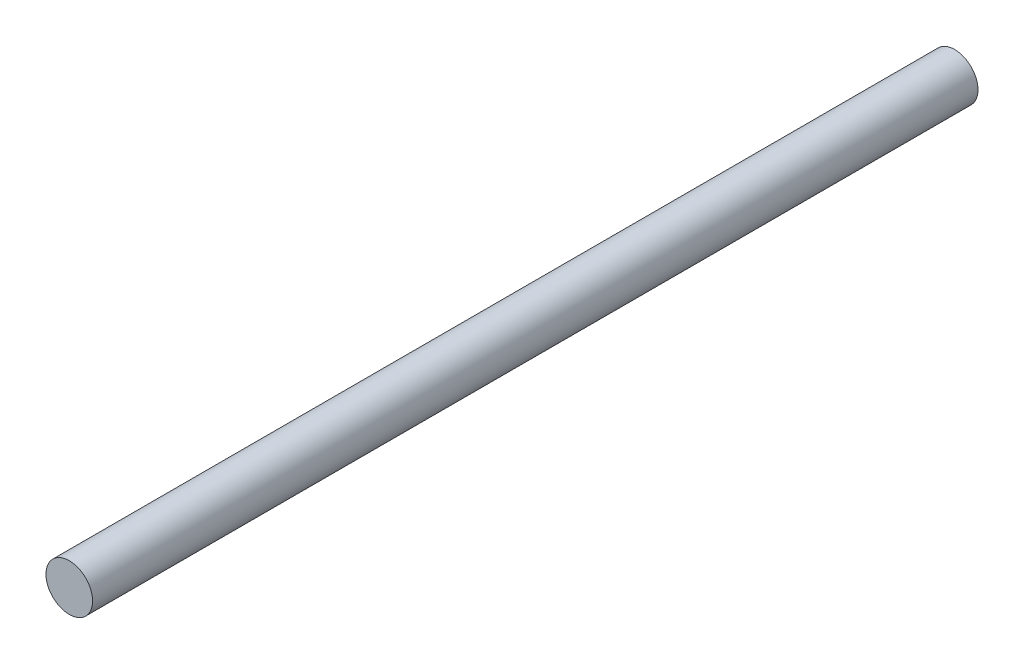
ISO-10303-21;
HEADER;
FILE_DESCRIPTION(('STEP AP214'),'2;1');
FILE_NAME('part.step','',(''),(''),'','','');
FILE_SCHEMA(('AUTOMOTIVE_DESIGN { 1 0 10303 214 1 1 1 1 }'));
ENDSEC;
DATA;
#1=APPLICATION_CONTEXT('core data for automotive mechanical design processes');
#2=APPLICATION_PROTOCOL_DEFINITION('international standard','automotive_design',2000,#1);
#3=PRODUCT_CONTEXT('',#1,'mechanical');
#4=PRODUCT('Part','Part','',(#3));
#5=PRODUCT_RELATED_PRODUCT_CATEGORY('part','',(#4));
#6=PRODUCT_DEFINITION_FORMATION('','',#4);
#7=PRODUCT_DEFINITION_CONTEXT('part definition',#1,'design');
#8=PRODUCT_DEFINITION('design','',#6,#7);
#9=PRODUCT_DEFINITION_SHAPE('','',#8);
#10=(LENGTH_UNIT() NAMED_UNIT(*) SI_UNIT(.MILLI.,.METRE.));
#11=(NAMED_UNIT(*) PLANE_ANGLE_UNIT() SI_UNIT($,.RADIAN.));
#12=(NAMED_UNIT(*) SI_UNIT($,.STERADIAN.) SOLID_ANGLE_UNIT());
#13=UNCERTAINTY_MEASURE_WITH_UNIT(LENGTH_MEASURE(1.E-05),#10,'distance_accuracy_value','');
#14=(GEOMETRIC_REPRESENTATION_CONTEXT(3) GLOBAL_UNCERTAINTY_ASSIGNED_CONTEXT((#13)) GLOBAL_UNIT_ASSIGNED_CONTEXT((#10,
#11,#12)) REPRESENTATION_CONTEXT('',''));
#15=CARTESIAN_POINT('',(0.,0.,0.));
#16=DIRECTION('',(0.,0.,1.));
#17=DIRECTION('',(1.,0.,0.));
#18=AXIS2_PLACEMENT_3D('',#15,#16,#17);
#19=CARTESIAN_POINT('',(0.,0.,95.));
#20=DIRECTION('',(0.,0.,-1.));
#21=DIRECTION('',(-1.,0.,0.));
#22=AXIS2_PLACEMENT_3D('',#19,#20,#21);
#23=CYLINDRICAL_SURFACE('',#22,2.5);
#24=CARTESIAN_POINT('',(0.,0.,95.));
#25=DIRECTION('',(0.,0.,1.));
#26=DIRECTION('',(1.,0.,0.));
#27=AXIS2_PLACEMENT_3D('',#24,#25,#26);
#28=CIRCLE('',#27,2.5);
#29=CARTESIAN_POINT('',(2.5,0.,95.));
#30=VERTEX_POINT('',#29);
#31=EDGE_CURVE('E10',#30,#30,#28,.T.);
#32=ORIENTED_EDGE('',*,*,#31,.F.);
#33=EDGE_LOOP('',(#32));
#34=FACE_BOUND('',#33,.T.);
#35=CARTESIAN_POINT('',(0.,0.,0.));
#36=DIRECTION('',(0.,0.,1.));
#37=DIRECTION('',(1.,0.,0.));
#38=AXIS2_PLACEMENT_3D('',#35,#36,#37);
#39=CIRCLE('',#38,2.5);
#40=CARTESIAN_POINT('',(2.5,0.,0.));
#41=VERTEX_POINT('',#40);
#42=EDGE_CURVE('E40',#41,#41,#39,.T.);
#43=ORIENTED_EDGE('',*,*,#42,.T.);
#44=EDGE_LOOP('',(#43));
#45=FACE_BOUND('',#44,.T.);
#46=ADVANCED_FACE('F37',(#34,#45),#23,.T.);
#47=CARTESIAN_POINT('',(0.,0.,95.));
#48=DIRECTION('',(0.,0.,1.));
#49=DIRECTION('',(1.,0.,0.));
#50=AXIS2_PLACEMENT_3D('',#47,#48,#49);
#51=PLANE('',#50);
#52=ORIENTED_EDGE('',*,*,#31,.T.);
#53=EDGE_LOOP('',(#52));
#54=FACE_BOUND('',#53,.T.);
#55=ADVANCED_FACE('F54',(#54),#51,.T.);
#56=CARTESIAN_POINT('',(0.,0.,0.));
#57=DIRECTION('',(0.,0.,1.));
#58=DIRECTION('',(1.,0.,0.));
#59=AXIS2_PLACEMENT_3D('',#56,#57,#58);
#60=PLANE('',#59);
#61=ORIENTED_EDGE('',*,*,#42,.F.);
#62=EDGE_LOOP('',(#61));
#63=FACE_BOUND('',#62,.T.);
#64=ADVANCED_FACE('F52',(#63),#60,.F.);
#65=CLOSED_SHELL('',(#46,#55,#64));
#66=MANIFOLD_SOLID_BREP('B2',#65);
#67=ADVANCED_BREP_SHAPE_REPRESENTATION('',(#18,#66),#14);
#68=SHAPE_DEFINITION_REPRESENTATION(#9,#67);
ENDSEC;
END-ISO-10303-21;
